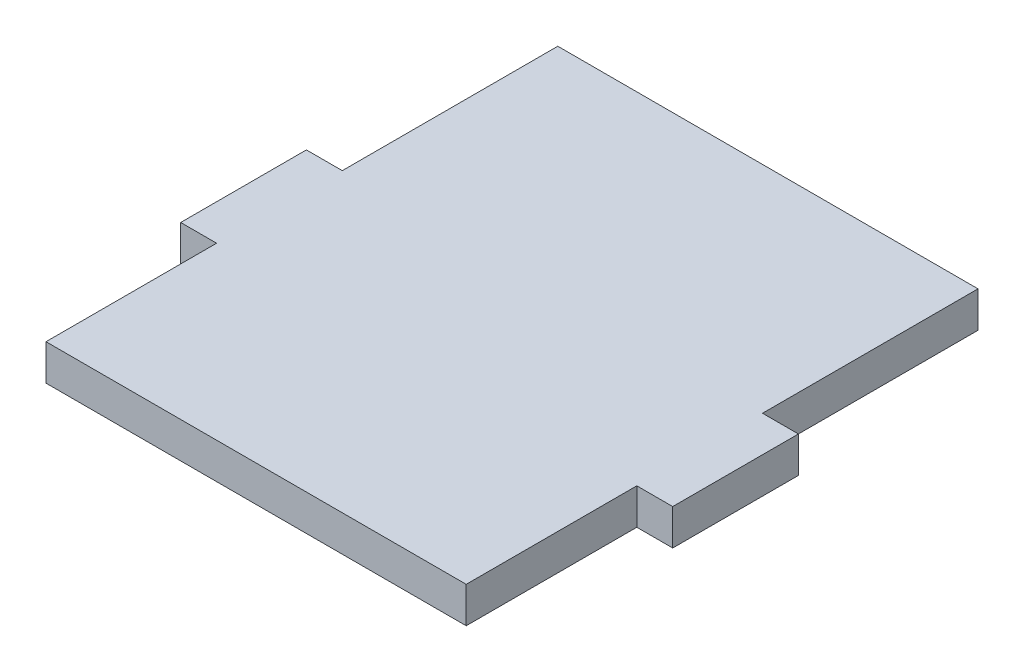
ISO-10303-21;
HEADER;
FILE_DESCRIPTION(('STEP AP214'),'2;1');
FILE_NAME('part.step','',(''),(''),'','','');
FILE_SCHEMA(('AUTOMOTIVE_DESIGN { 1 0 10303 214 1 1 1 1 }'));
ENDSEC;
DATA;
#1=APPLICATION_CONTEXT('core data for automotive mechanical design processes');
#2=APPLICATION_PROTOCOL_DEFINITION('international standard','automotive_design',2000,#1);
#3=PRODUCT_CONTEXT('',#1,'mechanical');
#4=PRODUCT('Part','Part','',(#3));
#5=PRODUCT_RELATED_PRODUCT_CATEGORY('part','',(#4));
#6=PRODUCT_DEFINITION_FORMATION('','',#4);
#7=PRODUCT_DEFINITION_CONTEXT('part definition',#1,'design');
#8=PRODUCT_DEFINITION('design','',#6,#7);
#9=PRODUCT_DEFINITION_SHAPE('','',#8);
#10=(LENGTH_UNIT() NAMED_UNIT(*) SI_UNIT(.MILLI.,.METRE.));
#11=(NAMED_UNIT(*) PLANE_ANGLE_UNIT() SI_UNIT($,.RADIAN.));
#12=(NAMED_UNIT(*) SI_UNIT($,.STERADIAN.) SOLID_ANGLE_UNIT());
#13=UNCERTAINTY_MEASURE_WITH_UNIT(LENGTH_MEASURE(1.E-05),#10,'distance_accuracy_value','');
#14=(GEOMETRIC_REPRESENTATION_CONTEXT(3) GLOBAL_UNCERTAINTY_ASSIGNED_CONTEXT((#13)) GLOBAL_UNIT_ASSIGNED_CONTEXT((#10,
#11,#12)) REPRESENTATION_CONTEXT('',''));
#15=CARTESIAN_POINT('',(0.,0.,0.));
#16=DIRECTION('',(0.,0.,1.));
#17=DIRECTION('',(1.,0.,0.));
#18=AXIS2_PLACEMENT_3D('',#15,#16,#17);
#19=CARTESIAN_POINT('',(11.7,2.,0.));
#20=DIRECTION('',(1.,0.,0.));
#21=DIRECTION('',(0.,0.,-1.));
#22=AXIS2_PLACEMENT_3D('',#19,#20,#21);
#23=PLANE('',#22);
#24=DIRECTION('',(0.,0.,1.));
#25=VECTOR('',#24,1.);
#26=CARTESIAN_POINT('',(11.7,0.,0.));
#27=LINE('',#26,#25);
#28=CARTESIAN_POINT('',(11.7,0.,-14.25));
#29=VERTEX_POINT('',#28);
#30=CARTESIAN_POINT('',(11.7,0.,-2.25));
#31=VERTEX_POINT('',#30);
#32=EDGE_CURVE('E151',#29,#31,#27,.T.);
#33=ORIENTED_EDGE('',*,*,#32,.F.);
#34=DIRECTION('',(0.,-1.,0.));
#35=VECTOR('',#34,1.);
#36=CARTESIAN_POINT('',(11.7,2.,-14.25));
#37=LINE('',#36,#35);
#38=CARTESIAN_POINT('',(11.7,2.,-14.25));
#39=VERTEX_POINT('',#38);
#40=EDGE_CURVE('E11',#39,#29,#37,.T.);
#41=ORIENTED_EDGE('',*,*,#40,.F.);
#42=DIRECTION('',(0.,0.,1.));
#43=VECTOR('',#42,1.);
#44=CARTESIAN_POINT('',(11.7,2.,0.));
#45=LINE('',#44,#43);
#46=CARTESIAN_POINT('',(11.7,2.,-2.25));
#47=VERTEX_POINT('',#46);
#48=EDGE_CURVE('E177',#39,#47,#45,.T.);
#49=ORIENTED_EDGE('',*,*,#48,.T.);
#50=DIRECTION('',(0.,-1.,0.));
#51=VECTOR('',#50,1.);
#52=CARTESIAN_POINT('',(11.7,2.,-2.25));
#53=LINE('',#52,#51);
#54=EDGE_CURVE('E51',#47,#31,#53,.T.);
#55=ORIENTED_EDGE('',*,*,#54,.T.);
#56=EDGE_LOOP('',(#33,#41,#49,#55));
#57=FACE_BOUND('',#56,.T.);
#58=ADVANCED_FACE('F34',(#57),#23,.T.);
#59=CARTESIAN_POINT('',(0.,2.,-14.25));
#60=DIRECTION('',(0.,0.,-1.));
#61=DIRECTION('',(-1.,0.,0.));
#62=AXIS2_PLACEMENT_3D('',#59,#60,#61);
#63=PLANE('',#62);
#64=DIRECTION('',(1.,0.,0.));
#65=VECTOR('',#64,1.);
#66=CARTESIAN_POINT('',(0.,0.,-14.25));
#67=LINE('',#66,#65);
#68=CARTESIAN_POINT('',(-11.7,0.,-14.25));
#69=VERTEX_POINT('',#68);
#70=EDGE_CURVE('E153',#69,#29,#67,.T.);
#71=ORIENTED_EDGE('',*,*,#70,.F.);
#72=DIRECTION('',(0.,-1.,0.));
#73=VECTOR('',#72,1.);
#74=CARTESIAN_POINT('',(-11.7,2.,-14.25));
#75=LINE('',#74,#73);
#76=CARTESIAN_POINT('',(-11.7,2.,-14.25));
#77=VERTEX_POINT('',#76);
#78=EDGE_CURVE('E43',#77,#69,#75,.T.);
#79=ORIENTED_EDGE('',*,*,#78,.F.);
#80=DIRECTION('',(1.,0.,0.));
#81=VECTOR('',#80,1.);
#82=CARTESIAN_POINT('',(0.,2.,-14.25));
#83=LINE('',#82,#81);
#84=EDGE_CURVE('E209',#77,#39,#83,.T.);
#85=ORIENTED_EDGE('',*,*,#84,.T.);
#86=ORIENTED_EDGE('',*,*,#40,.T.);
#87=EDGE_LOOP('',(#71,#79,#85,#86));
#88=FACE_BOUND('',#87,.T.);
#89=ADVANCED_FACE('F36',(#88),#63,.T.);
#90=CARTESIAN_POINT('',(-11.7,2.,0.));
#91=DIRECTION('',(1.,0.,0.));
#92=DIRECTION('',(0.,0.,-1.));
#93=AXIS2_PLACEMENT_3D('',#90,#91,#92);
#94=PLANE('',#93);
#95=DIRECTION('',(0.,0.,1.));
#96=VECTOR('',#95,1.);
#97=CARTESIAN_POINT('',(-11.7,0.,0.));
#98=LINE('',#97,#96);
#99=CARTESIAN_POINT('',(-11.7,0.,-2.25));
#100=VERTEX_POINT('',#99);
#101=EDGE_CURVE('E157',#69,#100,#98,.T.);
#102=ORIENTED_EDGE('',*,*,#101,.T.);
#103=DIRECTION('',(0.,-1.,0.));
#104=VECTOR('',#103,1.);
#105=CARTESIAN_POINT('',(-11.7,2.,-2.25));
#106=LINE('',#105,#104);
#107=CARTESIAN_POINT('',(-11.7,2.,-2.25));
#108=VERTEX_POINT('',#107);
#109=EDGE_CURVE('E193',#108,#100,#106,.T.);
#110=ORIENTED_EDGE('',*,*,#109,.F.);
#111=DIRECTION('',(0.,0.,1.));
#112=VECTOR('',#111,1.);
#113=CARTESIAN_POINT('',(-11.7,2.,0.));
#114=LINE('',#113,#112);
#115=EDGE_CURVE('E200',#77,#108,#114,.T.);
#116=ORIENTED_EDGE('',*,*,#115,.F.);
#117=ORIENTED_EDGE('',*,*,#78,.T.);
#118=EDGE_LOOP('',(#102,#110,#116,#117));
#119=FACE_BOUND('',#118,.T.);
#120=ADVANCED_FACE('F198',(#119),#94,.F.);
#121=CARTESIAN_POINT('',(0.,2.,-2.25));
#122=DIRECTION('',(0.,0.,1.));
#123=DIRECTION('',(1.,0.,0.));
#124=AXIS2_PLACEMENT_3D('',#121,#122,#123);
#125=PLANE('',#124);
#126=DIRECTION('',(-1.,0.,0.));
#127=VECTOR('',#126,1.);
#128=CARTESIAN_POINT('',(0.,0.,-2.25));
#129=LINE('',#128,#127);
#130=CARTESIAN_POINT('',(-13.7,0.,-2.25));
#131=VERTEX_POINT('',#130);
#132=EDGE_CURVE('E159',#100,#131,#129,.T.);
#133=ORIENTED_EDGE('',*,*,#132,.T.);
#134=DIRECTION('',(0.,-1.,0.));
#135=VECTOR('',#134,1.);
#136=CARTESIAN_POINT('',(-13.7,2.,-2.25));
#137=LINE('',#136,#135);
#138=CARTESIAN_POINT('',(-13.7,2.,-2.25));
#139=VERTEX_POINT('',#138);
#140=EDGE_CURVE('E190',#139,#131,#137,.T.);
#141=ORIENTED_EDGE('',*,*,#140,.F.);
#142=DIRECTION('',(-1.,0.,0.));
#143=VECTOR('',#142,1.);
#144=CARTESIAN_POINT('',(0.,2.,-2.25));
#145=LINE('',#144,#143);
#146=EDGE_CURVE('E263',#108,#139,#145,.T.);
#147=ORIENTED_EDGE('',*,*,#146,.F.);
#148=ORIENTED_EDGE('',*,*,#109,.T.);
#149=EDGE_LOOP('',(#133,#141,#147,#148));
#150=FACE_BOUND('',#149,.T.);
#151=ADVANCED_FACE('F262',(#150),#125,.F.);
#152=CARTESIAN_POINT('',(-13.7,2.,0.));
#153=DIRECTION('',(1.,0.,0.));
#154=DIRECTION('',(0.,0.,-1.));
#155=AXIS2_PLACEMENT_3D('',#152,#153,#154);
#156=PLANE('',#155);
#157=DIRECTION('',(0.,0.,1.));
#158=VECTOR('',#157,1.);
#159=CARTESIAN_POINT('',(-13.7,0.,0.));
#160=LINE('',#159,#158);
#161=CARTESIAN_POINT('',(-13.7,0.,4.75));
#162=VERTEX_POINT('',#161);
#163=EDGE_CURVE('E162',#131,#162,#160,.T.);
#164=ORIENTED_EDGE('',*,*,#163,.T.);
#165=DIRECTION('',(0.,-1.,0.));
#166=VECTOR('',#165,1.);
#167=CARTESIAN_POINT('',(-13.7,2.,4.75));
#168=LINE('',#167,#166);
#169=CARTESIAN_POINT('',(-13.7,2.,4.75));
#170=VERTEX_POINT('',#169);
#171=EDGE_CURVE('E188',#170,#162,#168,.T.);
#172=ORIENTED_EDGE('',*,*,#171,.F.);
#173=DIRECTION('',(0.,0.,1.));
#174=VECTOR('',#173,1.);
#175=CARTESIAN_POINT('',(-13.7,2.,0.));
#176=LINE('',#175,#174);
#177=EDGE_CURVE('E259',#139,#170,#176,.T.);
#178=ORIENTED_EDGE('',*,*,#177,.F.);
#179=ORIENTED_EDGE('',*,*,#140,.T.);
#180=EDGE_LOOP('',(#164,#172,#178,#179));
#181=FACE_BOUND('',#180,.T.);
#182=ADVANCED_FACE('F256',(#181),#156,.F.);
#183=CARTESIAN_POINT('',(0.,2.,4.75));
#184=DIRECTION('',(0.,0.,1.));
#185=DIRECTION('',(1.,0.,0.));
#186=AXIS2_PLACEMENT_3D('',#183,#184,#185);
#187=PLANE('',#186);
#188=DIRECTION('',(-1.,0.,0.));
#189=VECTOR('',#188,1.);
#190=CARTESIAN_POINT('',(0.,0.,4.75));
#191=LINE('',#190,#189);
#192=CARTESIAN_POINT('',(-11.7,0.,4.75));
#193=VERTEX_POINT('',#192);
#194=EDGE_CURVE('E165',#193,#162,#191,.T.);
#195=ORIENTED_EDGE('',*,*,#194,.F.);
#196=DIRECTION('',(0.,-1.,0.));
#197=VECTOR('',#196,1.);
#198=CARTESIAN_POINT('',(-11.7,2.,4.75));
#199=LINE('',#198,#197);
#200=CARTESIAN_POINT('',(-11.7,2.,4.75));
#201=VERTEX_POINT('',#200);
#202=EDGE_CURVE('E186',#201,#193,#199,.T.);
#203=ORIENTED_EDGE('',*,*,#202,.F.);
#204=DIRECTION('',(-1.,0.,0.));
#205=VECTOR('',#204,1.);
#206=CARTESIAN_POINT('',(0.,2.,4.75));
#207=LINE('',#206,#205);
#208=EDGE_CURVE('E253',#201,#170,#207,.T.);
#209=ORIENTED_EDGE('',*,*,#208,.T.);
#210=ORIENTED_EDGE('',*,*,#171,.T.);
#211=EDGE_LOOP('',(#195,#203,#209,#210));
#212=FACE_BOUND('',#211,.T.);
#213=ADVANCED_FACE('F252',(#212),#187,.T.);
#214=CARTESIAN_POINT('',(-11.7,0.,14.25));
#215=VERTEX_POINT('',#214);
#216=EDGE_CURVE('E160',#193,#215,#98,.T.);
#217=ORIENTED_EDGE('',*,*,#216,.T.);
#218=DIRECTION('',(0.,-1.,0.));
#219=VECTOR('',#218,1.);
#220=CARTESIAN_POINT('',(-11.7,2.,14.25));
#221=LINE('',#220,#219);
#222=CARTESIAN_POINT('',(-11.7,2.,14.25));
#223=VERTEX_POINT('',#222);
#224=EDGE_CURVE('E183',#223,#215,#221,.T.);
#225=ORIENTED_EDGE('',*,*,#224,.F.);
#226=EDGE_CURVE('E248',#201,#223,#114,.T.);
#227=ORIENTED_EDGE('',*,*,#226,.F.);
#228=ORIENTED_EDGE('',*,*,#202,.T.);
#229=EDGE_LOOP('',(#217,#225,#227,#228));
#230=FACE_BOUND('',#229,.T.);
#231=ADVANCED_FACE('F235',(#230),#94,.F.);
#232=CARTESIAN_POINT('',(0.,2.,14.25));
#233=DIRECTION('',(0.,0.,-1.));
#234=DIRECTION('',(-1.,0.,0.));
#235=AXIS2_PLACEMENT_3D('',#232,#233,#234);
#236=PLANE('',#235);
#237=DIRECTION('',(1.,0.,0.));
#238=VECTOR('',#237,1.);
#239=CARTESIAN_POINT('',(0.,0.,14.25));
#240=LINE('',#239,#238);
#241=CARTESIAN_POINT('',(11.7,0.,14.25));
#242=VERTEX_POINT('',#241);
#243=EDGE_CURVE('E168',#215,#242,#240,.T.);
#244=ORIENTED_EDGE('',*,*,#243,.T.);
#245=DIRECTION('',(0.,-1.,0.));
#246=VECTOR('',#245,1.);
#247=CARTESIAN_POINT('',(11.7,2.,14.25));
#248=LINE('',#247,#246);
#249=CARTESIAN_POINT('',(11.7,2.,14.25));
#250=VERTEX_POINT('',#249);
#251=EDGE_CURVE('E181',#250,#242,#248,.T.);
#252=ORIENTED_EDGE('',*,*,#251,.F.);
#253=DIRECTION('',(1.,0.,0.));
#254=VECTOR('',#253,1.);
#255=CARTESIAN_POINT('',(0.,2.,14.25));
#256=LINE('',#255,#254);
#257=EDGE_CURVE('E245',#223,#250,#256,.T.);
#258=ORIENTED_EDGE('',*,*,#257,.F.);
#259=ORIENTED_EDGE('',*,*,#224,.T.);
#260=EDGE_LOOP('',(#244,#252,#258,#259));
#261=FACE_BOUND('',#260,.T.);
#262=ADVANCED_FACE('F229',(#261),#236,.F.);
#263=CARTESIAN_POINT('',(11.7,0.,4.75));
#264=VERTEX_POINT('',#263);
#265=EDGE_CURVE('E154',#264,#242,#27,.T.);
#266=ORIENTED_EDGE('',*,*,#265,.F.);
#267=DIRECTION('',(0.,-1.,0.));
#268=VECTOR('',#267,1.);
#269=CARTESIAN_POINT('',(11.7,2.,4.75));
#270=LINE('',#269,#268);
#271=CARTESIAN_POINT('',(11.7,2.,4.75));
#272=VERTEX_POINT('',#271);
#273=EDGE_CURVE('E143',#272,#264,#270,.T.);
#274=ORIENTED_EDGE('',*,*,#273,.F.);
#275=EDGE_CURVE('E133',#272,#250,#45,.T.);
#276=ORIENTED_EDGE('',*,*,#275,.T.);
#277=ORIENTED_EDGE('',*,*,#251,.T.);
#278=EDGE_LOOP('',(#266,#274,#276,#277));
#279=FACE_BOUND('',#278,.T.);
#280=ADVANCED_FACE('F222',(#279),#23,.T.);
#281=CARTESIAN_POINT('',(0.,2.,4.75));
#282=DIRECTION('',(0.,0.,-1.));
#283=DIRECTION('',(-1.,0.,0.));
#284=AXIS2_PLACEMENT_3D('',#281,#282,#283);
#285=PLANE('',#284);
#286=DIRECTION('',(1.,0.,0.));
#287=VECTOR('',#286,1.);
#288=CARTESIAN_POINT('',(0.,0.,4.75));
#289=LINE('',#288,#287);
#290=CARTESIAN_POINT('',(13.7,0.,4.75));
#291=VERTEX_POINT('',#290);
#292=EDGE_CURVE('E140',#264,#291,#289,.T.);
#293=ORIENTED_EDGE('',*,*,#292,.T.);
#294=DIRECTION('',(0.,-1.,0.));
#295=VECTOR('',#294,1.);
#296=CARTESIAN_POINT('',(13.7,2.,4.75));
#297=LINE('',#296,#295);
#298=CARTESIAN_POINT('',(13.7,2.,4.75));
#299=VERTEX_POINT('',#298);
#300=EDGE_CURVE('E137',#299,#291,#297,.T.);
#301=ORIENTED_EDGE('',*,*,#300,.F.);
#302=DIRECTION('',(1.,0.,0.));
#303=VECTOR('',#302,1.);
#304=CARTESIAN_POINT('',(0.,2.,4.75));
#305=LINE('',#304,#303);
#306=EDGE_CURVE('E126',#272,#299,#305,.T.);
#307=ORIENTED_EDGE('',*,*,#306,.F.);
#308=ORIENTED_EDGE('',*,*,#273,.T.);
#309=EDGE_LOOP('',(#293,#301,#307,#308));
#310=FACE_BOUND('',#309,.T.);
#311=ADVANCED_FACE('F138',(#310),#285,.F.);
#312=CARTESIAN_POINT('',(13.7,2.,0.));
#313=DIRECTION('',(-1.,0.,0.));
#314=DIRECTION('',(0.,0.,1.));
#315=AXIS2_PLACEMENT_3D('',#312,#313,#314);
#316=PLANE('',#315);
#317=DIRECTION('',(0.,0.,-1.));
#318=VECTOR('',#317,1.);
#319=CARTESIAN_POINT('',(13.7,0.,0.));
#320=LINE('',#319,#318);
#321=CARTESIAN_POINT('',(13.7,0.,-2.25));
#322=VERTEX_POINT('',#321);
#323=EDGE_CURVE('E172',#291,#322,#320,.T.);
#324=ORIENTED_EDGE('',*,*,#323,.T.);
#325=DIRECTION('',(0.,-1.,0.));
#326=VECTOR('',#325,1.);
#327=CARTESIAN_POINT('',(13.7,2.,-2.25));
#328=LINE('',#327,#326);
#329=CARTESIAN_POINT('',(13.7,2.,-2.25));
#330=VERTEX_POINT('',#329);
#331=EDGE_CURVE('E89',#330,#322,#328,.T.);
#332=ORIENTED_EDGE('',*,*,#331,.F.);
#333=DIRECTION('',(0.,0.,-1.));
#334=VECTOR('',#333,1.);
#335=CARTESIAN_POINT('',(13.7,2.,0.));
#336=LINE('',#335,#334);
#337=EDGE_CURVE('E131',#299,#330,#336,.T.);
#338=ORIENTED_EDGE('',*,*,#337,.F.);
#339=ORIENTED_EDGE('',*,*,#300,.T.);
#340=EDGE_LOOP('',(#324,#332,#338,#339));
#341=FACE_BOUND('',#340,.T.);
#342=ADVANCED_FACE('F145',(#341),#316,.F.);
#343=CARTESIAN_POINT('',(0.,2.,-2.25));
#344=DIRECTION('',(0.,0.,-1.));
#345=DIRECTION('',(-1.,0.,0.));
#346=AXIS2_PLACEMENT_3D('',#343,#344,#345);
#347=PLANE('',#346);
#348=DIRECTION('',(1.,0.,0.));
#349=VECTOR('',#348,1.);
#350=CARTESIAN_POINT('',(0.,0.,-2.25));
#351=LINE('',#350,#349);
#352=EDGE_CURVE('E174',#31,#322,#351,.T.);
#353=ORIENTED_EDGE('',*,*,#352,.F.);
#354=ORIENTED_EDGE('',*,*,#54,.F.);
#355=DIRECTION('',(1.,0.,0.));
#356=VECTOR('',#355,1.);
#357=CARTESIAN_POINT('',(0.,2.,-2.25));
#358=LINE('',#357,#356);
#359=EDGE_CURVE('E146',#47,#330,#358,.T.);
#360=ORIENTED_EDGE('',*,*,#359,.T.);
#361=ORIENTED_EDGE('',*,*,#331,.T.);
#362=EDGE_LOOP('',(#353,#354,#360,#361));
#363=FACE_BOUND('',#362,.T.);
#364=ADVANCED_FACE('F210',(#363),#347,.T.);
#365=CARTESIAN_POINT('',(0.,2.,0.));
#366=DIRECTION('',(0.,1.,0.));
#367=DIRECTION('',(0.,0.,1.));
#368=AXIS2_PLACEMENT_3D('',#365,#366,#367);
#369=PLANE('',#368);
#370=ORIENTED_EDGE('',*,*,#48,.F.);
#371=ORIENTED_EDGE('',*,*,#84,.F.);
#372=ORIENTED_EDGE('',*,*,#115,.T.);
#373=ORIENTED_EDGE('',*,*,#146,.T.);
#374=ORIENTED_EDGE('',*,*,#177,.T.);
#375=ORIENTED_EDGE('',*,*,#208,.F.);
#376=ORIENTED_EDGE('',*,*,#226,.T.);
#377=ORIENTED_EDGE('',*,*,#257,.T.);
#378=ORIENTED_EDGE('',*,*,#275,.F.);
#379=ORIENTED_EDGE('',*,*,#306,.T.);
#380=ORIENTED_EDGE('',*,*,#337,.T.);
#381=ORIENTED_EDGE('',*,*,#359,.F.);
#382=EDGE_LOOP('',(#370,#371,#372,#373,#374,#375,#376,#377,#378,#379,#380,#381));
#383=FACE_BOUND('',#382,.T.);
#384=ADVANCED_FACE('F128',(#383),#369,.T.);
#385=CARTESIAN_POINT('',(0.,0.,0.));
#386=DIRECTION('',(0.,1.,0.));
#387=DIRECTION('',(0.,0.,1.));
#388=AXIS2_PLACEMENT_3D('',#385,#386,#387);
#389=PLANE('',#388);
#390=ORIENTED_EDGE('',*,*,#32,.T.);
#391=ORIENTED_EDGE('',*,*,#352,.T.);
#392=ORIENTED_EDGE('',*,*,#323,.F.);
#393=ORIENTED_EDGE('',*,*,#292,.F.);
#394=ORIENTED_EDGE('',*,*,#265,.T.);
#395=ORIENTED_EDGE('',*,*,#243,.F.);
#396=ORIENTED_EDGE('',*,*,#216,.F.);
#397=ORIENTED_EDGE('',*,*,#194,.T.);
#398=ORIENTED_EDGE('',*,*,#163,.F.);
#399=ORIENTED_EDGE('',*,*,#132,.F.);
#400=ORIENTED_EDGE('',*,*,#101,.F.);
#401=ORIENTED_EDGE('',*,*,#70,.T.);
#402=EDGE_LOOP('',(#390,#391,#392,#393,#394,#395,#396,#397,#398,#399,#400,#401));
#403=FACE_BOUND('',#402,.T.);
#404=ADVANCED_FACE('F207',(#403),#389,.F.);
#405=CLOSED_SHELL('',(#58,#89,#120,#151,#182,#213,#231,#262,#280,#311,#342,#364,#384,#404));
#406=MANIFOLD_SOLID_BREP('B2',#405);
#407=ADVANCED_BREP_SHAPE_REPRESENTATION('',(#18,#406),#14);
#408=SHAPE_DEFINITION_REPRESENTATION(#9,#407);
ENDSEC;
END-ISO-10303-21;
